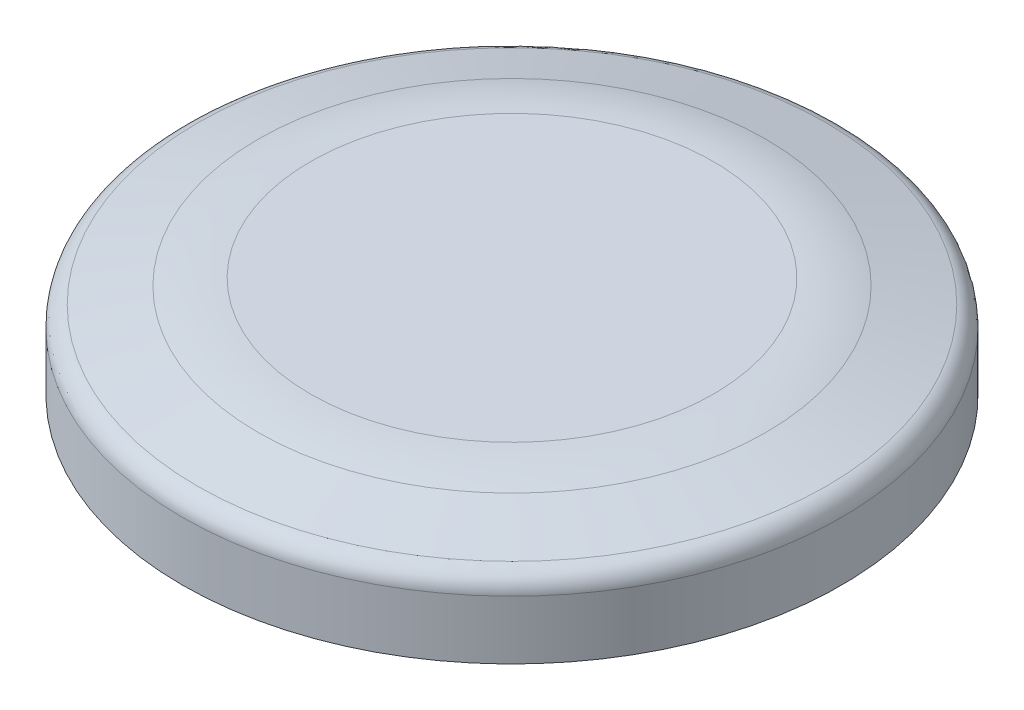
ISO-10303-21;
HEADER;
FILE_DESCRIPTION(('STEP AP214'),'2;1');
FILE_NAME('part.step','',(''),(''),'','','');
FILE_SCHEMA(('AUTOMOTIVE_DESIGN { 1 0 10303 214 1 1 1 1 }'));
ENDSEC;
DATA;
#1=APPLICATION_CONTEXT('core data for automotive mechanical design processes');
#2=APPLICATION_PROTOCOL_DEFINITION('international standard','automotive_design',2000,#1);
#3=PRODUCT_CONTEXT('',#1,'mechanical');
#4=PRODUCT('Part','Part','',(#3));
#5=PRODUCT_RELATED_PRODUCT_CATEGORY('part','',(#4));
#6=PRODUCT_DEFINITION_FORMATION('','',#4);
#7=PRODUCT_DEFINITION_CONTEXT('part definition',#1,'design');
#8=PRODUCT_DEFINITION('design','',#6,#7);
#9=PRODUCT_DEFINITION_SHAPE('','',#8);
#10=(LENGTH_UNIT() NAMED_UNIT(*) SI_UNIT(.MILLI.,.METRE.));
#11=(NAMED_UNIT(*) PLANE_ANGLE_UNIT() SI_UNIT($,.RADIAN.));
#12=(NAMED_UNIT(*) SI_UNIT($,.STERADIAN.) SOLID_ANGLE_UNIT());
#13=UNCERTAINTY_MEASURE_WITH_UNIT(LENGTH_MEASURE(1.E-05),#10,'distance_accuracy_value','');
#14=(GEOMETRIC_REPRESENTATION_CONTEXT(3) GLOBAL_UNCERTAINTY_ASSIGNED_CONTEXT((#13)) GLOBAL_UNIT_ASSIGNED_CONTEXT((#10,
#11,#12)) REPRESENTATION_CONTEXT('',''));
#15=CARTESIAN_POINT('',(0.,0.,0.));
#16=DIRECTION('',(0.,0.,1.));
#17=DIRECTION('',(1.,0.,0.));
#18=AXIS2_PLACEMENT_3D('',#15,#16,#17);
#19=CARTESIAN_POINT('',(0.,1.,0.));
#20=DIRECTION('',(0.,-1.,0.));
#21=DIRECTION('',(0.,0.,-1.));
#22=AXIS2_PLACEMENT_3D('',#19,#20,#21);
#23=CYLINDRICAL_SURFACE('',#22,3.25);
#24=CARTESIAN_POINT('',(0.,0.578585409973084,0.));
#25=DIRECTION('',(0.,1.,0.));
#26=DIRECTION('',(0.,0.,1.));
#27=AXIS2_PLACEMENT_3D('',#24,#25,#26);
#28=CIRCLE('',#27,3.25);
#29=CARTESIAN_POINT('',(0.,0.578585409973084,3.25));
#30=VERTEX_POINT('',#29);
#31=EDGE_CURVE('E49',#30,#30,#28,.F.);
#32=ORIENTED_EDGE('',*,*,#31,.T.);
#33=EDGE_LOOP('',(#32));
#34=FACE_BOUND('',#33,.T.);
#35=CARTESIAN_POINT('',(0.,0.,0.));
#36=DIRECTION('',(0.,1.,0.));
#37=DIRECTION('',(0.,0.,1.));
#38=AXIS2_PLACEMENT_3D('',#35,#36,#37);
#39=CIRCLE('',#38,3.25);
#40=CARTESIAN_POINT('',(0.,0.,3.25));
#41=VERTEX_POINT('',#40);
#42=EDGE_CURVE('E64',#41,#41,#39,.T.);
#43=ORIENTED_EDGE('',*,*,#42,.T.);
#44=EDGE_LOOP('',(#43));
#45=FACE_BOUND('',#44,.T.);
#46=ADVANCED_FACE('F43',(#34,#45),#23,.T.);
#47=CARTESIAN_POINT('',(0.,1.,0.));
#48=DIRECTION('',(0.,1.,0.));
#49=DIRECTION('',(0.,0.,1.));
#50=AXIS2_PLACEMENT_3D('',#47,#48,#49);
#51=PLANE('',#50);
#52=CARTESIAN_POINT('',(0.,1.,0.));
#53=DIRECTION('',(0.,1.,0.));
#54=DIRECTION('',(0.,0.,1.));
#55=AXIS2_PLACEMENT_3D('',#52,#53,#54);
#56=CIRCLE('',#55,1.9866950048252);
#57=CARTESIAN_POINT('',(0.,1.,1.9866950048252));
#58=VERTEX_POINT('',#57);
#59=EDGE_CURVE('E59',#58,#58,#56,.T.);
#60=ORIENTED_EDGE('',*,*,#59,.T.);
#61=EDGE_LOOP('',(#60));
#62=FACE_BOUND('',#61,.T.);
#63=ADVANCED_FACE('F72',(#62),#51,.T.);
#64=CARTESIAN_POINT('',(0.,0.,0.));
#65=DIRECTION('',(0.,1.,0.));
#66=DIRECTION('',(0.,0.,1.));
#67=AXIS2_PLACEMENT_3D('',#64,#65,#66);
#68=PLANE('',#67);
#69=ORIENTED_EDGE('',*,*,#42,.F.);
#70=EDGE_LOOP('',(#69));
#71=FACE_BOUND('',#70,.T.);
#72=ADVANCED_FACE('F69',(#71),#68,.F.);
#73=CARTESIAN_POINT('',(0.,1.,0.));
#74=DIRECTION('',(0.,-1.,0.));
#75=DIRECTION('',(0.,0.,-1.));
#76=AXIS2_PLACEMENT_3D('',#73,#74,#75);
#77=CONICAL_SURFACE('',#76,2.24999999999999,1.30899693899575);
#78=CARTESIAN_POINT('',(0.,0.771770575230897,0.));
#79=DIRECTION('',(0.,-1.,0.));
#80=DIRECTION('',(0.,0.,-1.));
#81=AXIS2_PLACEMENT_3D('',#78,#79,#80);
#82=CIRCLE('',#81,3.1017638090205);
#83=CARTESIAN_POINT('',(0.,0.771770575230897,-3.1017638090205));
#84=VERTEX_POINT('',#83);
#85=EDGE_CURVE('E10',#84,#84,#82,.F.);
#86=ORIENTED_EDGE('',*,*,#85,.T.);
#87=EDGE_LOOP('',(#86));
#88=FACE_BOUND('',#87,.T.);
#89=CARTESIAN_POINT('',(0.,0.931851652578138,0.));
#90=DIRECTION('',(0.,1.,0.));
#91=DIRECTION('',(0.,0.,1.));
#92=AXIS2_PLACEMENT_3D('',#89,#90,#91);
#93=CIRCLE('',#92,2.50433309503023);
#94=CARTESIAN_POINT('',(0.,0.931851652578138,2.50433309503023));
#95=VERTEX_POINT('',#94);
#96=EDGE_CURVE('E53',#95,#95,#93,.F.);
#97=ORIENTED_EDGE('',*,*,#96,.T.);
#98=EDGE_LOOP('',(#97));
#99=FACE_BOUND('',#98,.T.);
#100=ADVANCED_FACE('F68',(#88,#99),#77,.T.);
#101=CARTESIAN_POINT('',(0.,-1.,0.));
#102=DIRECTION('',(0.,1.,0.));
#103=DIRECTION('',(0.,0.,1.));
#104=AXIS2_PLACEMENT_3D('',#101,#102,#103);
#105=DEGENERATE_TOROIDAL_SURFACE('',#104,1.9866950048252,2.,.T.);
#106=ORIENTED_EDGE('',*,*,#96,.F.);
#107=EDGE_LOOP('',(#106));
#108=FACE_BOUND('',#107,.T.);
#109=ORIENTED_EDGE('',*,*,#59,.F.);
#110=EDGE_LOOP('',(#109));
#111=FACE_BOUND('',#110,.T.);
#112=ADVANCED_FACE('F77',(#108,#111),#105,.T.);
#113=CARTESIAN_POINT('',(0.,0.578585409973084,0.));
#114=DIRECTION('',(0.,1.,0.));
#115=DIRECTION('',(0.,0.,1.));
#116=AXIS2_PLACEMENT_3D('',#113,#114,#115);
#117=TOROIDAL_SURFACE('',#116,3.05,0.2);
#118=ORIENTED_EDGE('',*,*,#85,.F.);
#119=EDGE_LOOP('',(#118));
#120=FACE_BOUND('',#119,.T.);
#121=ORIENTED_EDGE('',*,*,#31,.F.);
#122=EDGE_LOOP('',(#121));
#123=FACE_BOUND('',#122,.T.);
#124=ADVANCED_FACE('F44',(#120,#123),#117,.T.);
#125=CLOSED_SHELL('',(#46,#63,#72,#100,#112,#124));
#126=MANIFOLD_SOLID_BREP('B2',#125);
#127=ADVANCED_BREP_SHAPE_REPRESENTATION('',(#18,#126),#14);
#128=SHAPE_DEFINITION_REPRESENTATION(#9,#127);
ENDSEC;
END-ISO-10303-21;
